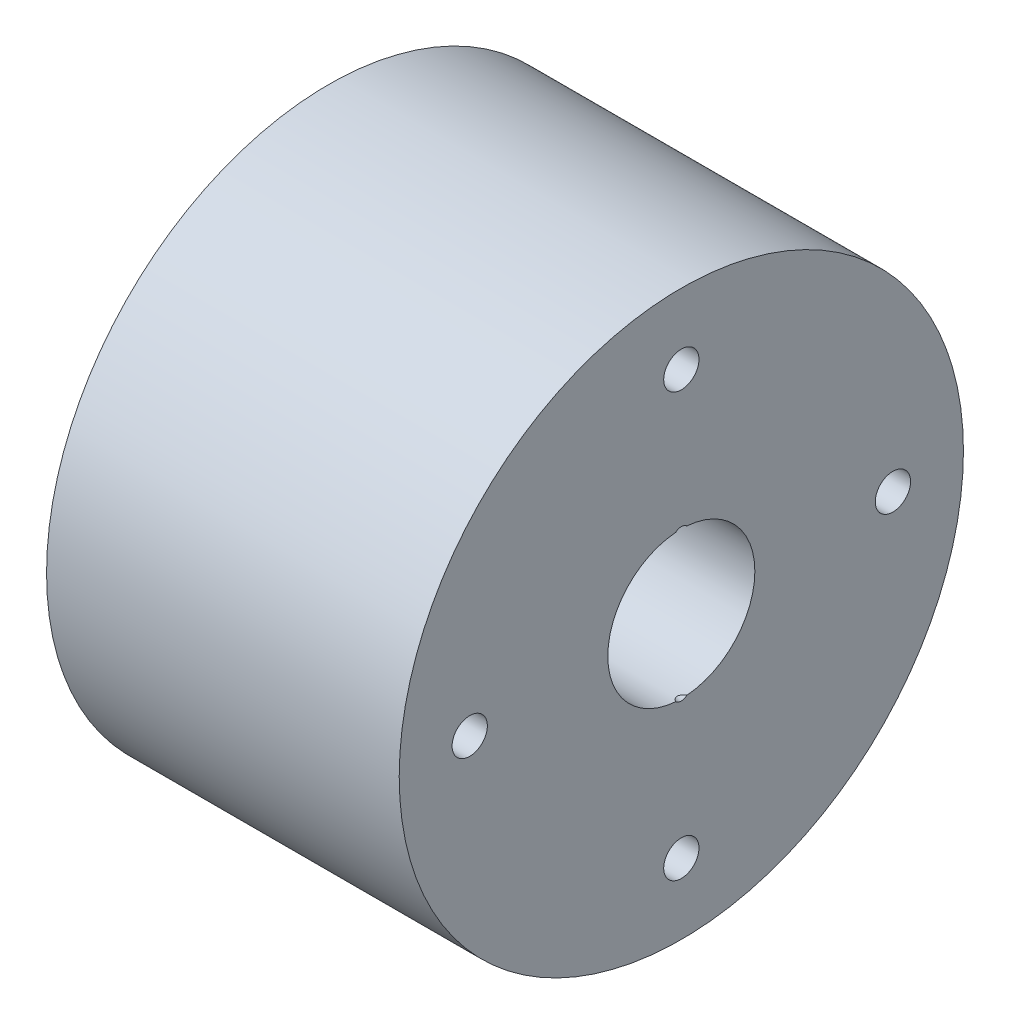
ISO-10303-21;
HEADER;
FILE_DESCRIPTION(('STEP AP214'),'2;1');
FILE_NAME('part.step','',(''),(''),'','','');
FILE_SCHEMA(('AUTOMOTIVE_DESIGN { 1 0 10303 214 1 1 1 1 }'));
ENDSEC;
DATA;
#1=APPLICATION_CONTEXT('core data for automotive mechanical design processes');
#2=APPLICATION_PROTOCOL_DEFINITION('international standard','automotive_design',2000,#1);
#3=PRODUCT_CONTEXT('',#1,'mechanical');
#4=PRODUCT('Part','Part','',(#3));
#5=PRODUCT_RELATED_PRODUCT_CATEGORY('part','',(#4));
#6=PRODUCT_DEFINITION_FORMATION('','',#4);
#7=PRODUCT_DEFINITION_CONTEXT('part definition',#1,'design');
#8=PRODUCT_DEFINITION('design','',#6,#7);
#9=PRODUCT_DEFINITION_SHAPE('','',#8);
#10=(LENGTH_UNIT() NAMED_UNIT(*) SI_UNIT(.MILLI.,.METRE.));
#11=(NAMED_UNIT(*) PLANE_ANGLE_UNIT() SI_UNIT($,.RADIAN.));
#12=(NAMED_UNIT(*) SI_UNIT($,.STERADIAN.) SOLID_ANGLE_UNIT());
#13=UNCERTAINTY_MEASURE_WITH_UNIT(LENGTH_MEASURE(1.E-05),#10,'distance_accuracy_value','');
#14=(GEOMETRIC_REPRESENTATION_CONTEXT(3) GLOBAL_UNCERTAINTY_ASSIGNED_CONTEXT((#13)) GLOBAL_UNIT_ASSIGNED_CONTEXT((#10,
#11,#12)) REPRESENTATION_CONTEXT('',''));
#15=CARTESIAN_POINT('',(0.,0.,0.));
#16=DIRECTION('',(0.,0.,1.));
#17=DIRECTION('',(1.,0.,0.));
#18=AXIS2_PLACEMENT_3D('',#15,#16,#17);
#19=CARTESIAN_POINT('',(50.,0.,0.));
#20=DIRECTION('',(1.,0.,0.));
#21=DIRECTION('',(0.,0.,-1.));
#22=AXIS2_PLACEMENT_3D('',#19,#20,#21);
#23=PLANE('',#22);
#24=CARTESIAN_POINT('',(50.,9.3261531631,0.));
#25=DIRECTION('',(1.,0.,0.));
#26=DIRECTION('',(0.,-1.,0.));
#27=AXIS2_PLACEMENT_3D('',#24,#25,#26);
#28=ELLIPSE('',#27,1.37922239870312,1.25);
#29=CARTESIAN_POINT('',(50.,10.3950256302546,0.789979206276418));
#30=VERTEX_POINT('',#29);
#31=CARTESIAN_POINT('',(50.,10.3950256302546,-0.789979206276413));
#32=VERTEX_POINT('',#31);
#33=EDGE_CURVE('E64',#30,#32,#28,.F.);
#34=ORIENTED_EDGE('',*,*,#33,.T.);
#35=CARTESIAN_POINT('',(50.,0.,0.));
#36=DIRECTION('',(1.,0.,0.));
#37=DIRECTION('',(0.,0.,-1.));
#38=AXIS2_PLACEMENT_3D('',#35,#36,#37);
#39=CIRCLE('',#38,10.425);
#40=CARTESIAN_POINT('',(50.,-10.3950256302546,-0.789979206276408));
#41=VERTEX_POINT('',#40);
#42=EDGE_CURVE('E87',#41,#32,#39,.T.);
#43=ORIENTED_EDGE('',*,*,#42,.F.);
#44=CARTESIAN_POINT('',(50.,-9.3261531631,0.));
#45=DIRECTION('',(1.,0.,0.));
#46=DIRECTION('',(0.,1.,0.));
#47=AXIS2_PLACEMENT_3D('',#44,#45,#46);
#48=ELLIPSE('',#47,1.37922239870312,1.25);
#49=CARTESIAN_POINT('',(50.,-10.3950256302546,0.789979206276414));
#50=VERTEX_POINT('',#49);
#51=EDGE_CURVE('E71',#50,#41,#48,.T.);
#52=ORIENTED_EDGE('',*,*,#51,.F.);
#53=EDGE_CURVE('E88',#30,#50,#39,.T.);
#54=ORIENTED_EDGE('',*,*,#53,.F.);
#55=EDGE_LOOP('',(#34,#43,#52,#54));
#56=FACE_BOUND('',#55,.T.);
#57=CARTESIAN_POINT('',(50.,30.,0.));
#58=DIRECTION('',(-1.,0.,0.));
#59=DIRECTION('',(0.,0.,1.));
#60=AXIS2_PLACEMENT_3D('',#57,#58,#59);
#61=CIRCLE('',#60,2.5);
#62=CARTESIAN_POINT('',(50.,30.,2.5));
#63=VERTEX_POINT('',#62);
#64=EDGE_CURVE('E126',#63,#63,#61,.T.);
#65=ORIENTED_EDGE('',*,*,#64,.T.);
#66=EDGE_LOOP('',(#65));
#67=FACE_BOUND('',#66,.T.);
#68=CARTESIAN_POINT('',(50.,8.47140372315957E-13,30.0000000000008));
#69=DIRECTION('',(-1.,0.,0.));
#70=DIRECTION('',(0.,0.,1.));
#71=AXIS2_PLACEMENT_3D('',#68,#69,#70);
#72=CIRCLE('',#71,2.50000000000066);
#73=CARTESIAN_POINT('',(50.,8.47140372315957E-13,32.5000000000015));
#74=VERTEX_POINT('',#73);
#75=EDGE_CURVE('E144',#74,#74,#72,.T.);
#76=ORIENTED_EDGE('',*,*,#75,.T.);
#77=EDGE_LOOP('',(#76));
#78=FACE_BOUND('',#77,.T.);
#79=CARTESIAN_POINT('',(50.,-30.,1.69428074463191E-12));
#80=DIRECTION('',(-1.,0.,0.));
#81=DIRECTION('',(0.,0.,1.));
#82=AXIS2_PLACEMENT_3D('',#79,#80,#81);
#83=CIRCLE('',#82,2.50000000000182);
#84=CARTESIAN_POINT('',(50.,-30.,2.50000000000351));
#85=VERTEX_POINT('',#84);
#86=EDGE_CURVE('E136',#85,#85,#83,.T.);
#87=ORIENTED_EDGE('',*,*,#86,.T.);
#88=EDGE_LOOP('',(#87));
#89=FACE_BOUND('',#88,.T.);
#90=CARTESIAN_POINT('',(50.,-8.50814312713399E-13,-29.9999999999992));
#91=DIRECTION('',(-1.,0.,0.));
#92=DIRECTION('',(0.,0.,1.));
#93=AXIS2_PLACEMENT_3D('',#90,#91,#92);
#94=CIRCLE('',#93,2.50000000000136);
#95=CARTESIAN_POINT('',(50.,-8.50814312713399E-13,-27.4999999999978));
#96=VERTEX_POINT('',#95);
#97=EDGE_CURVE('E127',#96,#96,#94,.T.);
#98=ORIENTED_EDGE('',*,*,#97,.T.);
#99=EDGE_LOOP('',(#98));
#100=FACE_BOUND('',#99,.T.);
#101=CARTESIAN_POINT('',(50.,0.,0.));
#102=DIRECTION('',(1.,0.,0.));
#103=DIRECTION('',(0.,0.,-1.));
#104=AXIS2_PLACEMENT_3D('',#101,#102,#103);
#105=CIRCLE('',#104,40.);
#106=CARTESIAN_POINT('',(50.,0.,-40.));
#107=VERTEX_POINT('',#106);
#108=EDGE_CURVE('E11',#107,#107,#105,.T.);
#109=ORIENTED_EDGE('',*,*,#108,.T.);
#110=EDGE_LOOP('',(#109));
#111=FACE_BOUND('',#110,.T.);
#112=ADVANCED_FACE('F49',(#56,#67,#78,#89,#100,#111),#23,.T.);
#113=CARTESIAN_POINT('',(20.,0.,0.));
#114=DIRECTION('',(1.,0.,0.));
#115=DIRECTION('',(0.,0.,-1.));
#116=AXIS2_PLACEMENT_3D('',#113,#114,#115);
#117=CYLINDRICAL_SURFACE('',#116,10.425);
#118=CARTESIAN_POINT('',(20.,0.,0.));
#119=DIRECTION('',(1.,0.,0.));
#120=DIRECTION('',(0.,0.,-1.));
#121=AXIS2_PLACEMENT_3D('',#118,#119,#120);
#122=CIRCLE('',#121,10.425);
#123=CARTESIAN_POINT('',(20.,0.,-10.425));
#124=VERTEX_POINT('',#123);
#125=EDGE_CURVE('E95',#124,#124,#122,.T.);
#126=ORIENTED_EDGE('',*,*,#125,.F.);
#127=EDGE_LOOP('',(#126));
#128=FACE_BOUND('',#127,.T.);
#129=ORIENTED_EDGE('',*,*,#42,.T.);
#130=CARTESIAN_POINT('',(50.,10.3950256302546,0.789979206276418));
#131=CARTESIAN_POINT('',(49.9669390452461,10.3964473869372,0.77125202120303));
#132=CARTESIAN_POINT('',(49.9343422149479,10.3978864617281,0.75166383993285));
#133=CARTESIAN_POINT('',(49.8702930585979,10.4007815357819,0.710495388296819));
#134=CARTESIAN_POINT('',(49.8388446084938,10.4022375737687,0.688909110244026));
#135=CARTESIAN_POINT('',(49.7769772459673,10.4051653354472,0.643188586578265));
#136=CARTESIAN_POINT('',(49.7465862785263,10.4066368827912,0.619016113368602));
#137=CARTESIAN_POINT('',(49.6879613274297,10.4095329410126,0.56823864954431));
#138=CARTESIAN_POINT('',(49.6597245639916,10.4109575111131,0.541636894564761));
#139=CARTESIAN_POINT('',(49.6015826974545,10.4139429430999,0.481125448885103));
#140=CARTESIAN_POINT('',(49.5721693034918,10.4154875860319,0.446733844205309));
#141=CARTESIAN_POINT('',(49.5186499767226,10.4183447577897,0.374198515318735));
#142=CARTESIAN_POINT('',(49.4945192561638,10.4196583647259,0.336073585238778));
#143=CARTESIAN_POINT('',(49.4570397700612,10.4217221852065,0.263435264280599));
#144=CARTESIAN_POINT('',(49.4425271573933,10.4225314600965,0.229531753527206));
#145=CARTESIAN_POINT('',(49.4193013241437,10.4238340480723,0.159756194921539));
#146=CARTESIAN_POINT('',(49.4105856657625,10.4243274939706,0.123884981427904));
#147=CARTESIAN_POINT('',(49.3997858562181,10.4249397595352,0.0509149205284939));
#148=CARTESIAN_POINT('',(49.3977407394792,10.4250563740369,0.0138101260487678));
#149=CARTESIAN_POINT('',(49.4006295394718,10.4248921832037,-0.0601260054374232));
#150=CARTESIAN_POINT('',(49.4055644323716,10.4246113222809,-0.0969573034706696));
#151=CARTESIAN_POINT('',(49.4211170178932,10.4237327691818,-0.16583257027336));
#152=CARTESIAN_POINT('',(49.4311764610118,10.4231662483738,-0.198007113517553));
#153=CARTESIAN_POINT('',(49.4558255995709,10.4217911404936,-0.26052473571284));
#154=CARTESIAN_POINT('',(49.47041468328,10.4209825861086,-0.290868061310762));
#155=CARTESIAN_POINT('',(49.5128626986537,10.4186582383695,-0.366523614042595));
#156=CARTESIAN_POINT('',(49.5435025133977,10.4170047399439,-0.41026701271453));
#157=CARTESIAN_POINT('',(49.6112840218757,10.4134366656785,-0.492623343002935));
#158=CARTESIAN_POINT('',(49.6484654125152,10.4115205125968,-0.531202261867548));
#159=CARTESIAN_POINT('',(49.7354043575263,10.4071671357816,-0.611077189984935));
#160=CARTESIAN_POINT('',(49.7861683293542,10.4047045069044,-0.65126555611511));
#161=CARTESIAN_POINT('',(49.8649355991287,10.4010315953885,-0.706752279574605));
#162=CARTESIAN_POINT('',(49.8914018672374,10.3998205976246,-0.724324089550998));
#163=CARTESIAN_POINT('',(49.9451318965612,10.3974113492958,-0.758120970539263));
#164=CARTESIAN_POINT('',(49.9723945031151,10.3962130834058,-0.774347872131283));
#165=CARTESIAN_POINT('',(50.,10.3950256302546,-0.789979206276413));
#166=B_SPLINE_CURVE_WITH_KNOTS('',3,(#130,#131,#132,#133,#134,#135,#136,#137,#138,#139,#140,
#141,#142,#143,#144,#145,#146,#147,#148,#149,#150,#151,#152,#153,#154,#155,#156,#157,#158,#159,
#160,#161,#162,#163,#164,#165),.UNSPECIFIED.,.F.,.F.,(4,2,2,2,2,2,2,2,2,2,2,2,2,2,2,2,2,4),(0.,
0.114087991202836,0.228530902732786,0.344992487440905,0.461301154955951,0.596773959799598,
0.731596774922018,0.841825059488395,0.952006960277237,1.06283247341226,1.17367348725015,
1.27442377712832,1.37516046651725,1.53453935338615,1.69492105457307,1.88870686029929,
1.98405553938811,2.07927223009016),.UNSPECIFIED.);
#167=EDGE_CURVE('E77',#30,#32,#166,.T.);
#168=ORIENTED_EDGE('',*,*,#167,.F.);
#169=ORIENTED_EDGE('',*,*,#53,.T.);
#170=CARTESIAN_POINT('',(50.,-10.3950256302546,0.789979206276414));
#171=CARTESIAN_POINT('',(49.9669390452461,-10.3964473869372,0.771252021203027));
#172=CARTESIAN_POINT('',(49.9343422149479,-10.3978864617281,0.751663839932849));
#173=CARTESIAN_POINT('',(49.8702930585979,-10.4007815357819,0.710495388296822));
#174=CARTESIAN_POINT('',(49.8388446084938,-10.4022375737687,0.688909110244029));
#175=CARTESIAN_POINT('',(49.7769772459673,-10.4051653354472,0.64318858657827));
#176=CARTESIAN_POINT('',(49.7465862785263,-10.4066368827911,0.619016113368607));
#177=CARTESIAN_POINT('',(49.6879613274297,-10.4095329410126,0.568238649544316));
#178=CARTESIAN_POINT('',(49.6597245639916,-10.4109575111131,0.541636894564767));
#179=CARTESIAN_POINT('',(49.6015826974545,-10.4139429430999,0.481125448885109));
#180=CARTESIAN_POINT('',(49.5721693034918,-10.4154875860319,0.446733844205317));
#181=CARTESIAN_POINT('',(49.5186499767226,-10.4183447577897,0.374198515318743));
#182=CARTESIAN_POINT('',(49.4945192561638,-10.4196583647259,0.336073585238784));
#183=CARTESIAN_POINT('',(49.4570397700612,-10.4217221852065,0.263435264280606));
#184=CARTESIAN_POINT('',(49.4425271573933,-10.4225314600965,0.229531753527213));
#185=CARTESIAN_POINT('',(49.4193013241437,-10.4238340480723,0.159756194921547));
#186=CARTESIAN_POINT('',(49.4105856657625,-10.4243274939706,0.123884981427913));
#187=CARTESIAN_POINT('',(49.3997858562181,-10.4249397595352,0.0509149205285033));
#188=CARTESIAN_POINT('',(49.3977407394792,-10.4250563740369,0.0138101260487773));
#189=CARTESIAN_POINT('',(49.4006295394718,-10.4248921832037,-0.0601260054374132));
#190=CARTESIAN_POINT('',(49.4055644323716,-10.4246113222809,-0.0969573034706593));
#191=CARTESIAN_POINT('',(49.4211170178932,-10.4237327691818,-0.165832570273349));
#192=CARTESIAN_POINT('',(49.4311764610118,-10.4231662483738,-0.198007113517541));
#193=CARTESIAN_POINT('',(49.4558255995709,-10.4217911404936,-0.26052473571283));
#194=CARTESIAN_POINT('',(49.47041468328,-10.4209825861086,-0.290868061310752));
#195=CARTESIAN_POINT('',(49.5128626986537,-10.4186582383695,-0.366523614042587));
#196=CARTESIAN_POINT('',(49.5435025133977,-10.4170047399439,-0.410267012714521));
#197=CARTESIAN_POINT('',(49.6112840218757,-10.4134366656785,-0.492623343002924));
#198=CARTESIAN_POINT('',(49.6484654125152,-10.4115205125968,-0.531202261867536));
#199=CARTESIAN_POINT('',(49.7354043575263,-10.4071671357816,-0.611077189984924));
#200=CARTESIAN_POINT('',(49.7861683293542,-10.4047045069044,-0.651265556115101));
#201=CARTESIAN_POINT('',(49.8649355991287,-10.4010315953885,-0.706752279574597));
#202=CARTESIAN_POINT('',(49.8914018672374,-10.3998205976246,-0.724324089550991));
#203=CARTESIAN_POINT('',(49.9451318965612,-10.3974113492958,-0.758120970539259));
#204=CARTESIAN_POINT('',(49.9723945031151,-10.3962130834058,-0.77434787213128));
#205=CARTESIAN_POINT('',(50.,-10.3950256302546,-0.789979206276411));
#206=B_SPLINE_CURVE_WITH_KNOTS('',3,(#170,#171,#172,#173,#174,#175,#176,#177,#178,#179,#180,
#181,#182,#183,#184,#185,#186,#187,#188,#189,#190,#191,#192,#193,#194,#195,#196,#197,#198,#199,
#200,#201,#202,#203,#204,#205),.UNSPECIFIED.,.F.,.F.,(4,2,2,2,2,2,2,2,2,2,2,2,2,2,2,2,2,4),(0.,
0.114087991202827,0.228530902732776,0.344992487440887,0.46130115495594,0.596773959799585,
0.731596774922005,0.841825059488381,0.952006960277222,1.06283247341225,1.17367348725013,
1.27442377712831,1.37516046651724,1.53453935338613,1.69492105457304,1.88870686029926,
1.98405553938809,2.07927223009015),.UNSPECIFIED.);
#207=EDGE_CURVE('E93',#50,#41,#206,.T.);
#208=ORIENTED_EDGE('',*,*,#207,.T.);
#209=EDGE_LOOP('',(#129,#168,#169,#208));
#210=FACE_BOUND('',#209,.T.);
#211=ADVANCED_FACE('F92',(#128,#210),#117,.F.);
#212=CARTESIAN_POINT('',(50.,0.,0.));
#213=DIRECTION('',(-1.,0.,0.));
#214=DIRECTION('',(0.,0.,1.));
#215=AXIS2_PLACEMENT_3D('',#212,#213,#214);
#216=CYLINDRICAL_SURFACE('',#215,40.);
#217=ORIENTED_EDGE('',*,*,#108,.F.);
#218=EDGE_LOOP('',(#217));
#219=FACE_BOUND('',#218,.T.);
#220=CARTESIAN_POINT('',(0.,0.,0.));
#221=DIRECTION('',(1.,0.,0.));
#222=DIRECTION('',(0.,0.,-1.));
#223=AXIS2_PLACEMENT_3D('',#220,#221,#222);
#224=CIRCLE('',#223,40.);
#225=CARTESIAN_POINT('',(0.,0.,-40.));
#226=VERTEX_POINT('',#225);
#227=EDGE_CURVE('E53',#226,#226,#224,.T.);
#228=ORIENTED_EDGE('',*,*,#227,.T.);
#229=EDGE_LOOP('',(#228));
#230=FACE_BOUND('',#229,.T.);
#231=ADVANCED_FACE('F51',(#219,#230),#216,.T.);
#232=CARTESIAN_POINT('',(0.,0.,0.));
#233=DIRECTION('',(1.,0.,0.));
#234=DIRECTION('',(0.,0.,-1.));
#235=AXIS2_PLACEMENT_3D('',#232,#233,#234);
#236=PLANE('',#235);
#237=CARTESIAN_POINT('',(0.,30.,0.));
#238=DIRECTION('',(-1.,0.,0.));
#239=DIRECTION('',(0.,0.,1.));
#240=AXIS2_PLACEMENT_3D('',#237,#238,#239);
#241=CIRCLE('',#240,2.5);
#242=CARTESIAN_POINT('',(0.,30.,2.5));
#243=VERTEX_POINT('',#242);
#244=EDGE_CURVE('E152',#243,#243,#241,.T.);
#245=ORIENTED_EDGE('',*,*,#244,.F.);
#246=EDGE_LOOP('',(#245));
#247=FACE_BOUND('',#246,.T.);
#248=CARTESIAN_POINT('',(0.,8.47140372315957E-13,30.0000000000008));
#249=DIRECTION('',(-1.,0.,0.));
#250=DIRECTION('',(0.,0.,1.));
#251=AXIS2_PLACEMENT_3D('',#248,#249,#250);
#252=CIRCLE('',#251,2.50000000000066);
#253=CARTESIAN_POINT('',(0.,8.47140372315957E-13,32.5000000000015));
#254=VERTEX_POINT('',#253);
#255=EDGE_CURVE('E148',#254,#254,#252,.T.);
#256=ORIENTED_EDGE('',*,*,#255,.F.);
#257=EDGE_LOOP('',(#256));
#258=FACE_BOUND('',#257,.T.);
#259=CARTESIAN_POINT('',(0.,-30.,1.69428074463191E-12));
#260=DIRECTION('',(-1.,0.,0.));
#261=DIRECTION('',(0.,0.,1.));
#262=AXIS2_PLACEMENT_3D('',#259,#260,#261);
#263=CIRCLE('',#262,2.50000000000182);
#264=CARTESIAN_POINT('',(0.,-30.,2.50000000000351));
#265=VERTEX_POINT('',#264);
#266=EDGE_CURVE('E140',#265,#265,#263,.T.);
#267=ORIENTED_EDGE('',*,*,#266,.F.);
#268=EDGE_LOOP('',(#267));
#269=FACE_BOUND('',#268,.T.);
#270=CARTESIAN_POINT('',(0.,-8.50814312713399E-13,-29.9999999999992));
#271=DIRECTION('',(-1.,0.,0.));
#272=DIRECTION('',(0.,0.,1.));
#273=AXIS2_PLACEMENT_3D('',#270,#271,#272);
#274=CIRCLE('',#273,2.50000000000136);
#275=CARTESIAN_POINT('',(0.,-8.50814312713399E-13,-27.4999999999978));
#276=VERTEX_POINT('',#275);
#277=EDGE_CURVE('E131',#276,#276,#274,.T.);
#278=ORIENTED_EDGE('',*,*,#277,.F.);
#279=EDGE_LOOP('',(#278));
#280=FACE_BOUND('',#279,.T.);
#281=CARTESIAN_POINT('',(0.,0.,0.));
#282=DIRECTION('',(-1.,0.,0.));
#283=DIRECTION('',(0.,0.,1.));
#284=AXIS2_PLACEMENT_3D('',#281,#282,#283);
#285=CIRCLE('',#284,20.);
#286=CARTESIAN_POINT('',(0.,0.,20.));
#287=VERTEX_POINT('',#286);
#288=EDGE_CURVE('E103',#287,#287,#285,.T.);
#289=ORIENTED_EDGE('',*,*,#288,.F.);
#290=EDGE_LOOP('',(#289));
#291=FACE_BOUND('',#290,.T.);
#292=ORIENTED_EDGE('',*,*,#227,.F.);
#293=EDGE_LOOP('',(#292));
#294=FACE_BOUND('',#293,.T.);
#295=ADVANCED_FACE('F221',(#247,#258,#269,#280,#291,#294),#236,.F.);
#296=CARTESIAN_POINT('',(20.,0.,0.));
#297=DIRECTION('',(1.,0.,0.));
#298=DIRECTION('',(0.,0.,-1.));
#299=AXIS2_PLACEMENT_3D('',#296,#297,#298);
#300=PLANE('',#299);
#301=CARTESIAN_POINT('',(20.,-4.66307658154999,0.));
#302=DIRECTION('',(1.,0.,0.));
#303=DIRECTION('',(0.,-1.,0.));
#304=AXIS2_PLACEMENT_3D('',#301,#302,#303);
#305=ELLIPSE('',#304,1.37922239870312,1.25);
#306=CARTESIAN_POINT('',(20.,-6.04229898025311,0.));
#307=VERTEX_POINT('',#306);
#308=EDGE_CURVE('E90',#307,#307,#305,.T.);
#309=ORIENTED_EDGE('',*,*,#308,.F.);
#310=EDGE_LOOP('',(#309));
#311=FACE_BOUND('',#310,.T.);
#312=CARTESIAN_POINT('',(20.,4.66307658155,0.));
#313=DIRECTION('',(1.,0.,0.));
#314=DIRECTION('',(0.,1.,0.));
#315=AXIS2_PLACEMENT_3D('',#312,#313,#314);
#316=ELLIPSE('',#315,1.37922239870312,1.25);
#317=CARTESIAN_POINT('',(20.,6.04229898025311,0.));
#318=VERTEX_POINT('',#317);
#319=EDGE_CURVE('E162',#318,#318,#316,.F.);
#320=ORIENTED_EDGE('',*,*,#319,.T.);
#321=EDGE_LOOP('',(#320));
#322=FACE_BOUND('',#321,.T.);
#323=CARTESIAN_POINT('',(20.,0.,0.));
#324=DIRECTION('',(1.,0.,0.));
#325=DIRECTION('',(0.,0.,-1.));
#326=AXIS2_PLACEMENT_3D('',#323,#324,#325);
#327=CIRCLE('',#326,0.5);
#328=CARTESIAN_POINT('',(20.,0.,-0.5));
#329=VERTEX_POINT('',#328);
#330=EDGE_CURVE('E115',#329,#329,#327,.T.);
#331=ORIENTED_EDGE('',*,*,#330,.F.);
#332=EDGE_LOOP('',(#331));
#333=FACE_BOUND('',#332,.T.);
#334=ORIENTED_EDGE('',*,*,#125,.T.);
#335=EDGE_LOOP('',(#334));
#336=FACE_BOUND('',#335,.T.);
#337=ADVANCED_FACE('F217',(#311,#322,#333,#336),#300,.T.);
#338=CARTESIAN_POINT('',(5.,0.,0.));
#339=DIRECTION('',(-1.,0.,0.));
#340=DIRECTION('',(0.,0.,1.));
#341=AXIS2_PLACEMENT_3D('',#338,#339,#340);
#342=CYLINDRICAL_SURFACE('',#341,20.);
#343=CARTESIAN_POINT('',(5.,0.,0.));
#344=DIRECTION('',(-1.,0.,0.));
#345=DIRECTION('',(0.,0.,1.));
#346=AXIS2_PLACEMENT_3D('',#343,#344,#345);
#347=CIRCLE('',#346,20.);
#348=CARTESIAN_POINT('',(5.,0.,20.));
#349=VERTEX_POINT('',#348);
#350=EDGE_CURVE('E101',#349,#349,#347,.T.);
#351=ORIENTED_EDGE('',*,*,#350,.F.);
#352=EDGE_LOOP('',(#351));
#353=FACE_BOUND('',#352,.T.);
#354=ORIENTED_EDGE('',*,*,#288,.T.);
#355=EDGE_LOOP('',(#354));
#356=FACE_BOUND('',#355,.T.);
#357=ADVANCED_FACE('F207',(#353,#356),#342,.F.);
#358=CARTESIAN_POINT('',(5.,0.,0.));
#359=DIRECTION('',(-1.,0.,0.));
#360=DIRECTION('',(0.,0.,1.));
#361=AXIS2_PLACEMENT_3D('',#358,#359,#360);
#362=PLANE('',#361);
#363=CARTESIAN_POINT('',(5.,-11.657691453875,0.));
#364=DIRECTION('',(-1.,0.,0.));
#365=DIRECTION('',(0.,1.,0.));
#366=AXIS2_PLACEMENT_3D('',#363,#364,#365);
#367=ELLIPSE('',#366,1.37922239870312,1.25);
#368=CARTESIAN_POINT('',(5.,-10.2784690551719,0.));
#369=VERTEX_POINT('',#368);
#370=EDGE_CURVE('E176',#369,#369,#367,.F.);
#371=ORIENTED_EDGE('',*,*,#370,.T.);
#372=EDGE_LOOP('',(#371));
#373=FACE_BOUND('',#372,.T.);
#374=CARTESIAN_POINT('',(5.,11.657691453875,0.));
#375=DIRECTION('',(-1.,0.,0.));
#376=DIRECTION('',(0.,-1.,0.));
#377=AXIS2_PLACEMENT_3D('',#374,#375,#376);
#378=ELLIPSE('',#377,1.37922239870312,1.25);
#379=CARTESIAN_POINT('',(5.,10.2784690551719,0.));
#380=VERTEX_POINT('',#379);
#381=EDGE_CURVE('E132',#380,#380,#378,.T.);
#382=ORIENTED_EDGE('',*,*,#381,.F.);
#383=EDGE_LOOP('',(#382));
#384=FACE_BOUND('',#383,.T.);
#385=CARTESIAN_POINT('',(5.,0.,0.));
#386=DIRECTION('',(-1.,0.,0.));
#387=DIRECTION('',(0.,0.,1.));
#388=AXIS2_PLACEMENT_3D('',#385,#386,#387);
#389=CIRCLE('',#388,10.);
#390=CARTESIAN_POINT('',(5.,0.,10.));
#391=VERTEX_POINT('',#390);
#392=EDGE_CURVE('E107',#391,#391,#389,.T.);
#393=ORIENTED_EDGE('',*,*,#392,.F.);
#394=EDGE_LOOP('',(#393));
#395=FACE_BOUND('',#394,.T.);
#396=ORIENTED_EDGE('',*,*,#350,.T.);
#397=EDGE_LOOP('',(#396));
#398=FACE_BOUND('',#397,.T.);
#399=ADVANCED_FACE('F203',(#373,#384,#395,#398),#362,.T.);
#400=CARTESIAN_POINT('',(5.,0.,0.));
#401=DIRECTION('',(-1.,0.,0.));
#402=DIRECTION('',(0.,0.,1.));
#403=AXIS2_PLACEMENT_3D('',#400,#401,#402);
#404=CYLINDRICAL_SURFACE('',#403,10.);
#405=ORIENTED_EDGE('',*,*,#392,.T.);
#406=EDGE_LOOP('',(#405));
#407=FACE_BOUND('',#406,.T.);
#408=CARTESIAN_POINT('',(0.,0.,0.));
#409=DIRECTION('',(-1.,0.,0.));
#410=DIRECTION('',(0.,0.,1.));
#411=AXIS2_PLACEMENT_3D('',#408,#409,#410);
#412=CIRCLE('',#411,10.);
#413=CARTESIAN_POINT('',(0.,0.,10.));
#414=VERTEX_POINT('',#413);
#415=EDGE_CURVE('E111',#414,#414,#412,.T.);
#416=ORIENTED_EDGE('',*,*,#415,.F.);
#417=EDGE_LOOP('',(#416));
#418=FACE_BOUND('',#417,.T.);
#419=ADVANCED_FACE('F206',(#407,#418),#404,.T.);
#420=CARTESIAN_POINT('',(0.,0.,0.));
#421=DIRECTION('',(-1.,0.,0.));
#422=DIRECTION('',(0.,0.,1.));
#423=AXIS2_PLACEMENT_3D('',#420,#421,#422);
#424=CIRCLE('',#423,0.5);
#425=CARTESIAN_POINT('',(0.,0.,0.5));
#426=VERTEX_POINT('',#425);
#427=EDGE_CURVE('E122',#426,#426,#424,.T.);
#428=ORIENTED_EDGE('',*,*,#427,.F.);
#429=EDGE_LOOP('',(#428));
#430=FACE_BOUND('',#429,.T.);
#431=ORIENTED_EDGE('',*,*,#415,.T.);
#432=EDGE_LOOP('',(#431));
#433=FACE_BOUND('',#432,.T.);
#434=ADVANCED_FACE('F225',(#430,#433),#236,.F.);
#435=CARTESIAN_POINT('',(50.,0.,0.));
#436=DIRECTION('',(-1.,0.,0.));
#437=DIRECTION('',(0.,0.,1.));
#438=AXIS2_PLACEMENT_3D('',#435,#436,#437);
#439=CYLINDRICAL_SURFACE('',#438,0.5);
#440=ORIENTED_EDGE('',*,*,#330,.T.);
#441=EDGE_LOOP('',(#440));
#442=FACE_BOUND('',#441,.T.);
#443=ORIENTED_EDGE('',*,*,#427,.T.);
#444=EDGE_LOOP('',(#443));
#445=FACE_BOUND('',#444,.T.);
#446=ADVANCED_FACE('F249',(#442,#445),#439,.F.);
#447=CARTESIAN_POINT('',(50.,-8.50814312713399E-13,-29.9999999999992));
#448=DIRECTION('',(-1.,0.,0.));
#449=DIRECTION('',(0.,0.,1.));
#450=AXIS2_PLACEMENT_3D('',#447,#448,#449);
#451=CYLINDRICAL_SURFACE('',#450,2.50000000000136);
#452=ORIENTED_EDGE('',*,*,#97,.F.);
#453=EDGE_LOOP('',(#452));
#454=FACE_BOUND('',#453,.T.);
#455=ORIENTED_EDGE('',*,*,#277,.T.);
#456=EDGE_LOOP('',(#455));
#457=FACE_BOUND('',#456,.T.);
#458=ADVANCED_FACE('F252',(#454,#457),#451,.F.);
#459=CARTESIAN_POINT('',(50.,-30.,1.69428074463191E-12));
#460=DIRECTION('',(-1.,0.,0.));
#461=DIRECTION('',(0.,0.,1.));
#462=AXIS2_PLACEMENT_3D('',#459,#460,#461);
#463=CYLINDRICAL_SURFACE('',#462,2.50000000000182);
#464=ORIENTED_EDGE('',*,*,#86,.F.);
#465=EDGE_LOOP('',(#464));
#466=FACE_BOUND('',#465,.T.);
#467=ORIENTED_EDGE('',*,*,#266,.T.);
#468=EDGE_LOOP('',(#467));
#469=FACE_BOUND('',#468,.T.);
#470=ADVANCED_FACE('F256',(#466,#469),#463,.F.);
#471=CARTESIAN_POINT('',(50.,8.47140372315957E-13,30.0000000000008));
#472=DIRECTION('',(-1.,0.,0.));
#473=DIRECTION('',(0.,0.,1.));
#474=AXIS2_PLACEMENT_3D('',#471,#472,#473);
#475=CYLINDRICAL_SURFACE('',#474,2.50000000000066);
#476=ORIENTED_EDGE('',*,*,#75,.F.);
#477=EDGE_LOOP('',(#476));
#478=FACE_BOUND('',#477,.T.);
#479=ORIENTED_EDGE('',*,*,#255,.T.);
#480=EDGE_LOOP('',(#479));
#481=FACE_BOUND('',#480,.T.);
#482=ADVANCED_FACE('F260',(#478,#481),#475,.F.);
#483=CARTESIAN_POINT('',(50.,30.,0.));
#484=DIRECTION('',(-1.,0.,0.));
#485=DIRECTION('',(0.,0.,1.));
#486=AXIS2_PLACEMENT_3D('',#483,#484,#485);
#487=CYLINDRICAL_SURFACE('',#486,2.5);
#488=ORIENTED_EDGE('',*,*,#64,.F.);
#489=EDGE_LOOP('',(#488));
#490=FACE_BOUND('',#489,.T.);
#491=ORIENTED_EDGE('',*,*,#244,.T.);
#492=EDGE_LOOP('',(#491));
#493=FACE_BOUND('',#492,.T.);
#494=ADVANCED_FACE('F264',(#490,#493),#487,.F.);
#495=CARTESIAN_POINT('',(-9.96390742370406,18.6354760814707,0.));
#496=DIRECTION('',(0.906307787036649,-0.4226182617407,0.));
#497=DIRECTION('',(0.4226182617407,0.906307787036649,0.));
#498=AXIS2_PLACEMENT_3D('',#495,#496,#497);
#499=CYLINDRICAL_SURFACE('',#498,1.25);
#500=ORIENTED_EDGE('',*,*,#381,.T.);
#501=EDGE_LOOP('',(#500));
#502=FACE_BOUND('',#501,.T.);
#503=ORIENTED_EDGE('',*,*,#319,.F.);
#504=EDGE_LOOP('',(#503));
#505=FACE_BOUND('',#504,.T.);
#506=ADVANCED_FACE('F267',(#502,#505),#499,.F.);
#507=CARTESIAN_POINT('',(61.7499693752714,-14.8052538658758,0.));
#508=DIRECTION('',(-0.906307787036649,0.4226182617407,0.));
#509=DIRECTION('',(-0.4226182617407,-0.906307787036649,0.));
#510=AXIS2_PLACEMENT_3D('',#507,#508,#509);
#511=CYLINDRICAL_SURFACE('',#510,1.25);
#512=ORIENTED_EDGE('',*,*,#51,.T.);
#513=ORIENTED_EDGE('',*,*,#207,.F.);
#514=EDGE_LOOP('',(#512,#513));
#515=FACE_BOUND('',#514,.T.);
#516=ADVANCED_FACE('F178',(#515),#511,.F.);
#517=CARTESIAN_POINT('',(-9.96390742370406,-18.6354760814707,0.));
#518=DIRECTION('',(0.906307787036649,0.4226182617407,0.));
#519=DIRECTION('',(-0.4226182617407,0.906307787036649,0.));
#520=AXIS2_PLACEMENT_3D('',#517,#518,#519);
#521=CYLINDRICAL_SURFACE('',#520,1.25);
#522=ORIENTED_EDGE('',*,*,#370,.F.);
#523=EDGE_LOOP('',(#522));
#524=FACE_BOUND('',#523,.T.);
#525=ORIENTED_EDGE('',*,*,#308,.T.);
#526=EDGE_LOOP('',(#525));
#527=FACE_BOUND('',#526,.T.);
#528=ADVANCED_FACE('F183',(#524,#527),#521,.F.);
#529=CARTESIAN_POINT('',(61.8101941743643,14.8333371509036,0.));
#530=DIRECTION('',(-0.90630778703665,-0.4226182617407,0.));
#531=DIRECTION('',(0.4226182617407,-0.90630778703665,0.));
#532=AXIS2_PLACEMENT_3D('',#529,#530,#531);
#533=CYLINDRICAL_SURFACE('',#532,1.25);
#534=ORIENTED_EDGE('',*,*,#167,.T.);
#535=ORIENTED_EDGE('',*,*,#33,.F.);
#536=EDGE_LOOP('',(#534,#535));
#537=FACE_BOUND('',#536,.T.);
#538=ADVANCED_FACE('F78',(#537),#533,.F.);
#539=CLOSED_SHELL('',(#112,#211,#231,#295,#337,#357,#399,#419,#434,#446,#458,#470,#482,#494,
#506,#516,#528,#538));
#540=MANIFOLD_SOLID_BREP('B2',#539);
#541=ADVANCED_BREP_SHAPE_REPRESENTATION('',(#18,#540),#14);
#542=SHAPE_DEFINITION_REPRESENTATION(#9,#541);
ENDSEC;
END-ISO-10303-21;
